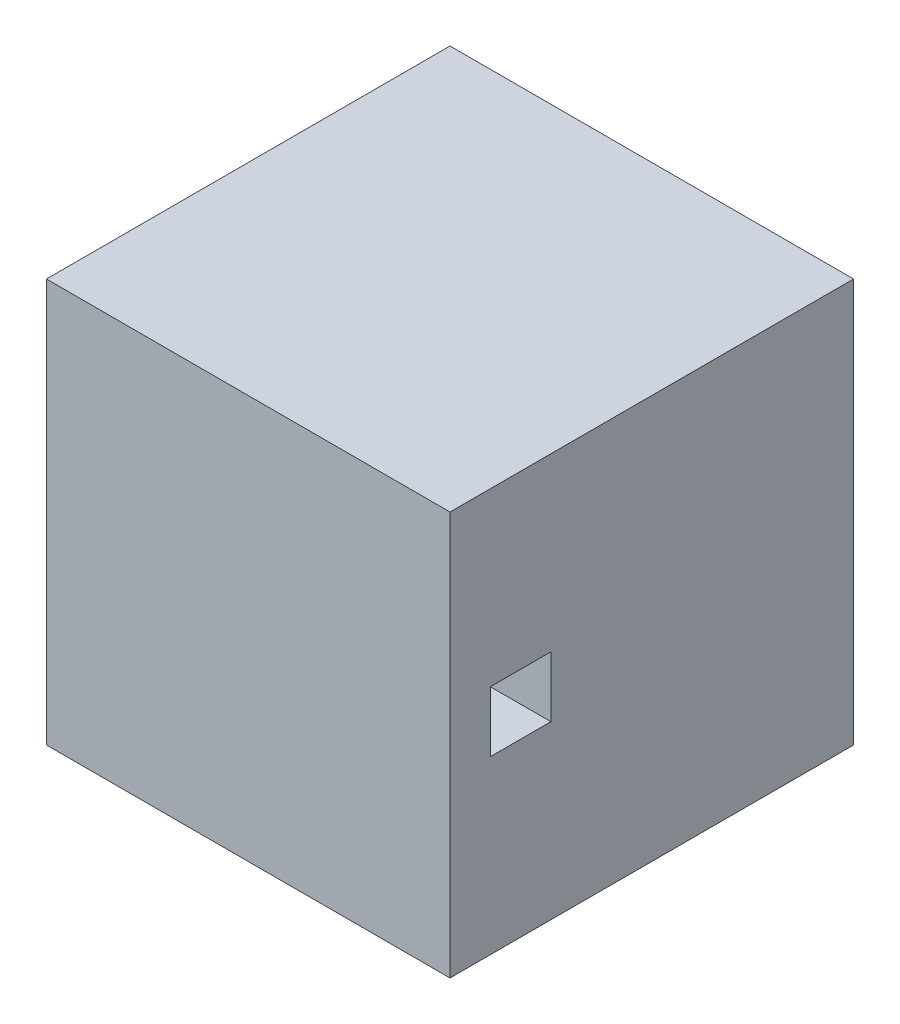
ISO-10303-21;
HEADER;
FILE_DESCRIPTION(('STEP AP214'),'2;1');
FILE_NAME('part.step','',(''),(''),'','','');
FILE_SCHEMA(('AUTOMOTIVE_DESIGN { 1 0 10303 214 1 1 1 1 }'));
ENDSEC;
DATA;
#1=APPLICATION_CONTEXT('core data for automotive mechanical design processes');
#2=APPLICATION_PROTOCOL_DEFINITION('international standard','automotive_design',2000,#1);
#3=PRODUCT_CONTEXT('',#1,'mechanical');
#4=PRODUCT('Part','Part','',(#3));
#5=PRODUCT_RELATED_PRODUCT_CATEGORY('part','',(#4));
#6=PRODUCT_DEFINITION_FORMATION('','',#4);
#7=PRODUCT_DEFINITION_CONTEXT('part definition',#1,'design');
#8=PRODUCT_DEFINITION('design','',#6,#7);
#9=PRODUCT_DEFINITION_SHAPE('','',#8);
#10=(LENGTH_UNIT() NAMED_UNIT(*) SI_UNIT(.MILLI.,.METRE.));
#11=(NAMED_UNIT(*) PLANE_ANGLE_UNIT() SI_UNIT($,.RADIAN.));
#12=(NAMED_UNIT(*) SI_UNIT($,.STERADIAN.) SOLID_ANGLE_UNIT());
#13=UNCERTAINTY_MEASURE_WITH_UNIT(LENGTH_MEASURE(1.E-05),#10,'distance_accuracy_value','');
#14=(GEOMETRIC_REPRESENTATION_CONTEXT(3) GLOBAL_UNCERTAINTY_ASSIGNED_CONTEXT((#13)) GLOBAL_UNIT_ASSIGNED_CONTEXT((#10,
#11,#12)) REPRESENTATION_CONTEXT('',''));
#15=CARTESIAN_POINT('',(0.,0.,0.));
#16=DIRECTION('',(0.,0.,1.));
#17=DIRECTION('',(1.,0.,0.));
#18=AXIS2_PLACEMENT_3D('',#15,#16,#17);
#19=CARTESIAN_POINT('',(-12.7,-12.7,25.4));
#20=DIRECTION('',(1.,0.,0.));
#21=DIRECTION('',(0.,0.,-1.));
#22=AXIS2_PLACEMENT_3D('',#19,#20,#21);
#23=PLANE('',#22);
#24=DIRECTION('',(0.,-1.,0.));
#25=VECTOR('',#24,1.);
#26=CARTESIAN_POINT('',(-12.7,-12.7,0.));
#27=LINE('',#26,#25);
#28=CARTESIAN_POINT('',(-12.7,12.7,0.));
#29=VERTEX_POINT('',#28);
#30=CARTESIAN_POINT('',(-12.7,-12.7,0.));
#31=VERTEX_POINT('',#30);
#32=EDGE_CURVE('E204',#29,#31,#27,.T.);
#33=ORIENTED_EDGE('',*,*,#32,.T.);
#34=DIRECTION('',(0.,0.,-1.));
#35=VECTOR('',#34,1.);
#36=CARTESIAN_POINT('',(-12.7,-12.7,25.4));
#37=LINE('',#36,#35);
#38=CARTESIAN_POINT('',(-12.7,-12.7,25.4));
#39=VERTEX_POINT('',#38);
#40=EDGE_CURVE('E47',#39,#31,#37,.T.);
#41=ORIENTED_EDGE('',*,*,#40,.F.);
#42=DIRECTION('',(0.,-1.,0.));
#43=VECTOR('',#42,1.);
#44=CARTESIAN_POINT('',(-12.7,-12.7,25.4));
#45=LINE('',#44,#43);
#46=CARTESIAN_POINT('',(-12.7,12.7,25.4));
#47=VERTEX_POINT('',#46);
#48=EDGE_CURVE('E214',#47,#39,#45,.T.);
#49=ORIENTED_EDGE('',*,*,#48,.F.);
#50=DIRECTION('',(0.,0.,-1.));
#51=VECTOR('',#50,1.);
#52=CARTESIAN_POINT('',(-12.7,12.7,25.4));
#53=LINE('',#52,#51);
#54=EDGE_CURVE('E228',#47,#29,#53,.T.);
#55=ORIENTED_EDGE('',*,*,#54,.T.);
#56=EDGE_LOOP('',(#33,#41,#49,#55));
#57=FACE_BOUND('',#56,.T.);
#58=ADVANCED_FACE('F39',(#57),#23,.F.);
#59=CARTESIAN_POINT('',(12.7,-12.7,25.4));
#60=DIRECTION('',(0.,1.,0.));
#61=DIRECTION('',(-1.,0.,0.));
#62=AXIS2_PLACEMENT_3D('',#59,#60,#61);
#63=PLANE('',#62);
#64=DIRECTION('',(1.,0.,0.));
#65=VECTOR('',#64,1.);
#66=CARTESIAN_POINT('',(12.7,-12.7,0.));
#67=LINE('',#66,#65);
#68=CARTESIAN_POINT('',(12.7,-12.7,0.));
#69=VERTEX_POINT('',#68);
#70=EDGE_CURVE('E232',#31,#69,#67,.T.);
#71=ORIENTED_EDGE('',*,*,#70,.T.);
#72=DIRECTION('',(0.,0.,-1.));
#73=VECTOR('',#72,1.);
#74=CARTESIAN_POINT('',(12.7,-12.7,25.4));
#75=LINE('',#74,#73);
#76=CARTESIAN_POINT('',(12.7,-12.7,25.4));
#77=VERTEX_POINT('',#76);
#78=EDGE_CURVE('E247',#77,#69,#75,.T.);
#79=ORIENTED_EDGE('',*,*,#78,.F.);
#80=DIRECTION('',(1.,0.,0.));
#81=VECTOR('',#80,1.);
#82=CARTESIAN_POINT('',(12.7,-12.7,25.4));
#83=LINE('',#82,#81);
#84=EDGE_CURVE('E218',#39,#77,#83,.T.);
#85=ORIENTED_EDGE('',*,*,#84,.F.);
#86=ORIENTED_EDGE('',*,*,#40,.T.);
#87=EDGE_LOOP('',(#71,#79,#85,#86));
#88=FACE_BOUND('',#87,.T.);
#89=ADVANCED_FACE('F254',(#88),#63,.F.);
#90=CARTESIAN_POINT('',(12.7,-12.7,25.4));
#91=DIRECTION('',(-1.,0.,0.));
#92=DIRECTION('',(0.,0.,1.));
#93=AXIS2_PLACEMENT_3D('',#90,#91,#92);
#94=PLANE('',#93);
#95=DIRECTION('',(0.,0.,-1.));
#96=VECTOR('',#95,1.);
#97=CARTESIAN_POINT('',(12.7,-1.905,19.05));
#98=LINE('',#97,#96);
#99=CARTESIAN_POINT('',(12.7,-1.905,22.86));
#100=VERTEX_POINT('',#99);
#101=CARTESIAN_POINT('',(12.7,-1.905,19.05));
#102=VERTEX_POINT('',#101);
#103=EDGE_CURVE('E139',#100,#102,#98,.T.);
#104=ORIENTED_EDGE('',*,*,#103,.F.);
#105=DIRECTION('',(0.,-1.,0.));
#106=VECTOR('',#105,1.);
#107=CARTESIAN_POINT('',(12.7,1.905,22.86));
#108=LINE('',#107,#106);
#109=CARTESIAN_POINT('',(12.7,1.905,22.86));
#110=VERTEX_POINT('',#109);
#111=EDGE_CURVE('E54',#110,#100,#108,.T.);
#112=ORIENTED_EDGE('',*,*,#111,.F.);
#113=DIRECTION('',(0.,0.,1.));
#114=VECTOR('',#113,1.);
#115=CARTESIAN_POINT('',(12.7,1.905,19.05));
#116=LINE('',#115,#114);
#117=CARTESIAN_POINT('',(12.7,1.905,19.05));
#118=VERTEX_POINT('',#117);
#119=EDGE_CURVE('E147',#118,#110,#116,.T.);
#120=ORIENTED_EDGE('',*,*,#119,.F.);
#121=DIRECTION('',(0.,1.,0.));
#122=VECTOR('',#121,1.);
#123=CARTESIAN_POINT('',(12.7,1.905,19.05));
#124=LINE('',#123,#122);
#125=EDGE_CURVE('E131',#102,#118,#124,.T.);
#126=ORIENTED_EDGE('',*,*,#125,.F.);
#127=EDGE_LOOP('',(#104,#112,#120,#126));
#128=FACE_BOUND('',#127,.T.);
#129=DIRECTION('',(0.,1.,0.));
#130=VECTOR('',#129,1.);
#131=CARTESIAN_POINT('',(12.7,-12.7,0.));
#132=LINE('',#131,#130);
#133=CARTESIAN_POINT('',(12.7,12.7,0.));
#134=VERTEX_POINT('',#133);
#135=EDGE_CURVE('E235',#69,#134,#132,.T.);
#136=ORIENTED_EDGE('',*,*,#135,.T.);
#137=DIRECTION('',(0.,0.,-1.));
#138=VECTOR('',#137,1.);
#139=CARTESIAN_POINT('',(12.7,12.7,25.4));
#140=LINE('',#139,#138);
#141=CARTESIAN_POINT('',(12.7,12.7,25.4));
#142=VERTEX_POINT('',#141);
#143=EDGE_CURVE('E243',#142,#134,#140,.T.);
#144=ORIENTED_EDGE('',*,*,#143,.F.);
#145=DIRECTION('',(0.,1.,0.));
#146=VECTOR('',#145,1.);
#147=CARTESIAN_POINT('',(12.7,-12.7,25.4));
#148=LINE('',#147,#146);
#149=EDGE_CURVE('E222',#77,#142,#148,.T.);
#150=ORIENTED_EDGE('',*,*,#149,.F.);
#151=ORIENTED_EDGE('',*,*,#78,.T.);
#152=EDGE_LOOP('',(#136,#144,#150,#151));
#153=FACE_BOUND('',#152,.T.);
#154=ADVANCED_FACE('F144',(#128,#153),#94,.F.);
#155=CARTESIAN_POINT('',(12.7,12.7,25.4));
#156=DIRECTION('',(0.,-1.,0.));
#157=DIRECTION('',(1.,0.,0.));
#158=AXIS2_PLACEMENT_3D('',#155,#156,#157);
#159=PLANE('',#158);
#160=DIRECTION('',(-1.,0.,0.));
#161=VECTOR('',#160,1.);
#162=CARTESIAN_POINT('',(12.7,12.7,0.));
#163=LINE('',#162,#161);
#164=EDGE_CURVE('E219',#134,#29,#163,.T.);
#165=ORIENTED_EDGE('',*,*,#164,.T.);
#166=ORIENTED_EDGE('',*,*,#54,.F.);
#167=DIRECTION('',(-1.,0.,0.));
#168=VECTOR('',#167,1.);
#169=CARTESIAN_POINT('',(12.7,12.7,25.4));
#170=LINE('',#169,#168);
#171=EDGE_CURVE('E225',#142,#47,#170,.T.);
#172=ORIENTED_EDGE('',*,*,#171,.F.);
#173=ORIENTED_EDGE('',*,*,#143,.T.);
#174=EDGE_LOOP('',(#165,#166,#172,#173));
#175=FACE_BOUND('',#174,.T.);
#176=ADVANCED_FACE('F268',(#175),#159,.F.);
#177=CARTESIAN_POINT('',(0.,0.,25.4));
#178=DIRECTION('',(0.,0.,1.));
#179=DIRECTION('',(1.,0.,0.));
#180=AXIS2_PLACEMENT_3D('',#177,#178,#179);
#181=PLANE('',#180);
#182=ORIENTED_EDGE('',*,*,#48,.T.);
#183=ORIENTED_EDGE('',*,*,#84,.T.);
#184=ORIENTED_EDGE('',*,*,#149,.T.);
#185=ORIENTED_EDGE('',*,*,#171,.T.);
#186=EDGE_LOOP('',(#182,#183,#184,#185));
#187=FACE_BOUND('',#186,.T.);
#188=ADVANCED_FACE('F270',(#187),#181,.T.);
#189=CARTESIAN_POINT('',(0.,0.,0.));
#190=DIRECTION('',(0.,0.,1.));
#191=DIRECTION('',(1.,0.,0.));
#192=AXIS2_PLACEMENT_3D('',#189,#190,#191);
#193=PLANE('',#192);
#194=DIRECTION('',(1.,0.,0.));
#195=VECTOR('',#194,1.);
#196=CARTESIAN_POINT('',(1.27,3.81,0.));
#197=LINE('',#196,#195);
#198=CARTESIAN_POINT('',(-11.43,3.81,0.));
#199=VERTEX_POINT('',#198);
#200=CARTESIAN_POINT('',(1.27,3.81,0.));
#201=VERTEX_POINT('',#200);
#202=EDGE_CURVE('E190',#199,#201,#197,.T.);
#203=ORIENTED_EDGE('',*,*,#202,.F.);
#204=DIRECTION('',(0.,1.,0.));
#205=VECTOR('',#204,1.);
#206=CARTESIAN_POINT('',(-11.43,-3.81,0.));
#207=LINE('',#206,#205);
#208=CARTESIAN_POINT('',(-11.43,-3.81,0.));
#209=VERTEX_POINT('',#208);
#210=EDGE_CURVE('E168',#209,#199,#207,.T.);
#211=ORIENTED_EDGE('',*,*,#210,.F.);
#212=DIRECTION('',(-1.,0.,0.));
#213=VECTOR('',#212,1.);
#214=CARTESIAN_POINT('',(1.27,-3.81,0.));
#215=LINE('',#214,#213);
#216=CARTESIAN_POINT('',(1.27,-3.81,0.));
#217=VERTEX_POINT('',#216);
#218=EDGE_CURVE('E174',#217,#209,#215,.T.);
#219=ORIENTED_EDGE('',*,*,#218,.F.);
#220=DIRECTION('',(0.,-1.,0.));
#221=VECTOR('',#220,1.);
#222=CARTESIAN_POINT('',(1.27,-3.81,0.));
#223=LINE('',#222,#221);
#224=EDGE_CURVE('E194',#201,#217,#223,.T.);
#225=ORIENTED_EDGE('',*,*,#224,.F.);
#226=EDGE_LOOP('',(#203,#211,#219,#225));
#227=FACE_BOUND('',#226,.T.);
#228=ORIENTED_EDGE('',*,*,#32,.F.);
#229=ORIENTED_EDGE('',*,*,#164,.F.);
#230=ORIENTED_EDGE('',*,*,#135,.F.);
#231=ORIENTED_EDGE('',*,*,#70,.F.);
#232=EDGE_LOOP('',(#228,#229,#230,#231));
#233=FACE_BOUND('',#232,.T.);
#234=ADVANCED_FACE('F262',(#227,#233),#193,.F.);
#235=CARTESIAN_POINT('',(-11.43,-3.81,22.86));
#236=DIRECTION('',(-1.,0.,0.));
#237=DIRECTION('',(0.,0.,1.));
#238=AXIS2_PLACEMENT_3D('',#235,#236,#237);
#239=PLANE('',#238);
#240=ORIENTED_EDGE('',*,*,#210,.T.);
#241=DIRECTION('',(0.,0.,-1.));
#242=VECTOR('',#241,1.);
#243=CARTESIAN_POINT('',(-11.43,3.81,22.86));
#244=LINE('',#243,#242);
#245=CARTESIAN_POINT('',(-11.43,3.81,22.86));
#246=VERTEX_POINT('',#245);
#247=EDGE_CURVE('E187',#246,#199,#244,.T.);
#248=ORIENTED_EDGE('',*,*,#247,.F.);
#249=DIRECTION('',(0.,1.,0.));
#250=VECTOR('',#249,1.);
#251=CARTESIAN_POINT('',(-11.43,-3.81,22.86));
#252=LINE('',#251,#250);
#253=CARTESIAN_POINT('',(-11.43,-3.81,22.86));
#254=VERTEX_POINT('',#253);
#255=EDGE_CURVE('E169',#254,#246,#252,.T.);
#256=ORIENTED_EDGE('',*,*,#255,.F.);
#257=DIRECTION('',(0.,0.,-1.));
#258=VECTOR('',#257,1.);
#259=CARTESIAN_POINT('',(-11.43,-3.81,22.86));
#260=LINE('',#259,#258);
#261=EDGE_CURVE('E201',#254,#209,#260,.T.);
#262=ORIENTED_EDGE('',*,*,#261,.T.);
#263=EDGE_LOOP('',(#240,#248,#256,#262));
#264=FACE_BOUND('',#263,.T.);
#265=ADVANCED_FACE('F277',(#264),#239,.F.);
#266=CARTESIAN_POINT('',(1.27,-3.81,22.86));
#267=DIRECTION('',(0.,-1.,0.));
#268=DIRECTION('',(0.,0.,-1.));
#269=AXIS2_PLACEMENT_3D('',#266,#267,#268);
#270=PLANE('',#269);
#271=ORIENTED_EDGE('',*,*,#218,.T.);
#272=ORIENTED_EDGE('',*,*,#261,.F.);
#273=DIRECTION('',(-1.,0.,0.));
#274=VECTOR('',#273,1.);
#275=CARTESIAN_POINT('',(1.27,-3.81,22.86));
#276=LINE('',#275,#274);
#277=CARTESIAN_POINT('',(1.27,-3.81,22.86));
#278=VERTEX_POINT('',#277);
#279=EDGE_CURVE('E183',#278,#254,#276,.T.);
#280=ORIENTED_EDGE('',*,*,#279,.F.);
#281=DIRECTION('',(0.,0.,-1.));
#282=VECTOR('',#281,1.);
#283=CARTESIAN_POINT('',(1.27,-3.81,22.86));
#284=LINE('',#283,#282);
#285=EDGE_CURVE('E205',#278,#217,#284,.T.);
#286=ORIENTED_EDGE('',*,*,#285,.T.);
#287=EDGE_LOOP('',(#271,#272,#280,#286));
#288=FACE_BOUND('',#287,.T.);
#289=ADVANCED_FACE('F319',(#288),#270,.F.);
#290=CARTESIAN_POINT('',(1.27,-3.81,22.86));
#291=DIRECTION('',(1.,0.,0.));
#292=DIRECTION('',(0.,0.,-1.));
#293=AXIS2_PLACEMENT_3D('',#290,#291,#292);
#294=PLANE('',#293);
#295=DIRECTION('',(0.,1.,0.));
#296=VECTOR('',#295,1.);
#297=CARTESIAN_POINT('',(1.27,-3.81,19.05));
#298=LINE('',#297,#296);
#299=CARTESIAN_POINT('',(1.27,-1.905,19.05));
#300=VERTEX_POINT('',#299);
#301=CARTESIAN_POINT('',(1.27,1.905,19.05));
#302=VERTEX_POINT('',#301);
#303=EDGE_CURVE('E11',#300,#302,#298,.T.);
#304=ORIENTED_EDGE('',*,*,#303,.T.);
#305=DIRECTION('',(0.,0.,1.));
#306=VECTOR('',#305,1.);
#307=CARTESIAN_POINT('',(1.27,1.905,22.86));
#308=LINE('',#307,#306);
#309=CARTESIAN_POINT('',(1.27,1.905,22.86));
#310=VERTEX_POINT('',#309);
#311=EDGE_CURVE('E164',#302,#310,#308,.T.);
#312=ORIENTED_EDGE('',*,*,#311,.T.);
#313=DIRECTION('',(0.,-1.,0.));
#314=VECTOR('',#313,1.);
#315=CARTESIAN_POINT('',(1.27,-3.81,22.86));
#316=LINE('',#315,#314);
#317=CARTESIAN_POINT('',(1.27,3.81,22.86));
#318=VERTEX_POINT('',#317);
#319=EDGE_CURVE('E179',#318,#310,#316,.T.);
#320=ORIENTED_EDGE('',*,*,#319,.F.);
#321=DIRECTION('',(0.,0.,-1.));
#322=VECTOR('',#321,1.);
#323=CARTESIAN_POINT('',(1.27,3.81,22.86));
#324=LINE('',#323,#322);
#325=EDGE_CURVE('E208',#318,#201,#324,.T.);
#326=ORIENTED_EDGE('',*,*,#325,.T.);
#327=ORIENTED_EDGE('',*,*,#224,.T.);
#328=ORIENTED_EDGE('',*,*,#285,.F.);
#329=CARTESIAN_POINT('',(1.27,-1.905,22.86));
#330=VERTEX_POINT('',#329);
#331=EDGE_CURVE('E178',#330,#278,#316,.T.);
#332=ORIENTED_EDGE('',*,*,#331,.F.);
#333=DIRECTION('',(0.,0.,-1.));
#334=VECTOR('',#333,1.);
#335=CARTESIAN_POINT('',(1.27,-1.905,22.86));
#336=LINE('',#335,#334);
#337=EDGE_CURVE('E157',#330,#300,#336,.T.);
#338=ORIENTED_EDGE('',*,*,#337,.T.);
#339=EDGE_LOOP('',(#304,#312,#320,#326,#327,#328,#332,#338));
#340=FACE_BOUND('',#339,.T.);
#341=ADVANCED_FACE('F327',(#340),#294,.F.);
#342=CARTESIAN_POINT('',(1.27,3.81,22.86));
#343=DIRECTION('',(0.,1.,0.));
#344=DIRECTION('',(0.,0.,1.));
#345=AXIS2_PLACEMENT_3D('',#342,#343,#344);
#346=PLANE('',#345);
#347=ORIENTED_EDGE('',*,*,#202,.T.);
#348=ORIENTED_EDGE('',*,*,#325,.F.);
#349=DIRECTION('',(1.,0.,0.));
#350=VECTOR('',#349,1.);
#351=CARTESIAN_POINT('',(1.27,3.81,22.86));
#352=LINE('',#351,#350);
#353=EDGE_CURVE('E173',#246,#318,#352,.T.);
#354=ORIENTED_EDGE('',*,*,#353,.F.);
#355=ORIENTED_EDGE('',*,*,#247,.T.);
#356=EDGE_LOOP('',(#347,#348,#354,#355));
#357=FACE_BOUND('',#356,.T.);
#358=ADVANCED_FACE('F335',(#357),#346,.F.);
#359=CARTESIAN_POINT('',(0.,0.,22.86));
#360=DIRECTION('',(0.,0.,1.));
#361=DIRECTION('',(1.,0.,0.));
#362=AXIS2_PLACEMENT_3D('',#359,#360,#361);
#363=PLANE('',#362);
#364=ORIENTED_EDGE('',*,*,#319,.T.);
#365=DIRECTION('',(1.,0.,0.));
#366=VECTOR('',#365,1.);
#367=CARTESIAN_POINT('',(-10.16,1.905,22.86));
#368=LINE('',#367,#366);
#369=EDGE_CURVE('E154',#310,#110,#368,.T.);
#370=ORIENTED_EDGE('',*,*,#369,.T.);
#371=ORIENTED_EDGE('',*,*,#111,.T.);
#372=DIRECTION('',(1.,0.,0.));
#373=VECTOR('',#372,1.);
#374=CARTESIAN_POINT('',(-10.16,-1.905,22.86));
#375=LINE('',#374,#373);
#376=EDGE_CURVE('E136',#330,#100,#375,.T.);
#377=ORIENTED_EDGE('',*,*,#376,.F.);
#378=ORIENTED_EDGE('',*,*,#331,.T.);
#379=ORIENTED_EDGE('',*,*,#279,.T.);
#380=ORIENTED_EDGE('',*,*,#255,.T.);
#381=ORIENTED_EDGE('',*,*,#353,.T.);
#382=EDGE_LOOP('',(#364,#370,#371,#377,#378,#379,#380,#381));
#383=FACE_BOUND('',#382,.T.);
#384=ADVANCED_FACE('F339',(#383),#363,.F.);
#385=CARTESIAN_POINT('',(-10.16,1.905,19.05));
#386=DIRECTION('',(0.,0.,-1.));
#387=DIRECTION('',(-1.,0.,0.));
#388=AXIS2_PLACEMENT_3D('',#385,#386,#387);
#389=PLANE('',#388);
#390=DIRECTION('',(1.,0.,0.));
#391=VECTOR('',#390,1.);
#392=CARTESIAN_POINT('',(-10.16,-1.905,19.05));
#393=LINE('',#392,#391);
#394=EDGE_CURVE('E62',#300,#102,#393,.T.);
#395=ORIENTED_EDGE('',*,*,#394,.T.);
#396=ORIENTED_EDGE('',*,*,#125,.T.);
#397=DIRECTION('',(1.,0.,0.));
#398=VECTOR('',#397,1.);
#399=CARTESIAN_POINT('',(-10.16,1.905,19.05));
#400=LINE('',#399,#398);
#401=EDGE_CURVE('E135',#302,#118,#400,.T.);
#402=ORIENTED_EDGE('',*,*,#401,.F.);
#403=ORIENTED_EDGE('',*,*,#303,.F.);
#404=EDGE_LOOP('',(#395,#396,#402,#403));
#405=FACE_BOUND('',#404,.T.);
#406=ADVANCED_FACE('F128',(#405),#389,.F.);
#407=CARTESIAN_POINT('',(-10.16,1.905,19.05));
#408=DIRECTION('',(0.,1.,0.));
#409=DIRECTION('',(0.,0.,1.));
#410=AXIS2_PLACEMENT_3D('',#407,#408,#409);
#411=PLANE('',#410);
#412=ORIENTED_EDGE('',*,*,#401,.T.);
#413=ORIENTED_EDGE('',*,*,#119,.T.);
#414=ORIENTED_EDGE('',*,*,#369,.F.);
#415=ORIENTED_EDGE('',*,*,#311,.F.);
#416=EDGE_LOOP('',(#412,#413,#414,#415));
#417=FACE_BOUND('',#416,.T.);
#418=ADVANCED_FACE('F357',(#417),#411,.F.);
#419=CARTESIAN_POINT('',(-10.16,-1.905,19.05));
#420=DIRECTION('',(0.,-1.,0.));
#421=DIRECTION('',(0.,0.,-1.));
#422=AXIS2_PLACEMENT_3D('',#419,#420,#421);
#423=PLANE('',#422);
#424=ORIENTED_EDGE('',*,*,#376,.T.);
#425=ORIENTED_EDGE('',*,*,#103,.T.);
#426=ORIENTED_EDGE('',*,*,#394,.F.);
#427=ORIENTED_EDGE('',*,*,#337,.F.);
#428=EDGE_LOOP('',(#424,#425,#426,#427));
#429=FACE_BOUND('',#428,.T.);
#430=ADVANCED_FACE('F140',(#429),#423,.F.);
#431=CLOSED_SHELL('',(#58,#89,#154,#176,#188,#234,#265,#289,#341,#358,#384,#406,#418,#430));
#432=MANIFOLD_SOLID_BREP('B2',#431);
#433=ADVANCED_BREP_SHAPE_REPRESENTATION('',(#18,#432),#14);
#434=SHAPE_DEFINITION_REPRESENTATION(#9,#433);
ENDSEC;
END-ISO-10303-21;
